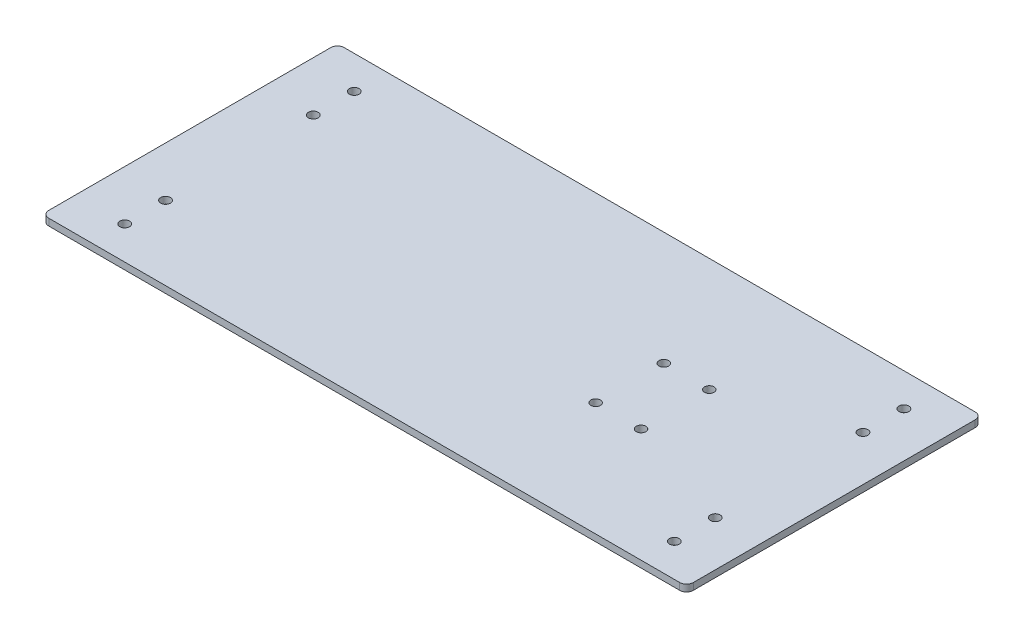
ISO-10303-21;
HEADER;
FILE_DESCRIPTION(('STEP AP214'),'2;1');
FILE_NAME('part.step','',(''),(''),'','','');
FILE_SCHEMA(('AUTOMOTIVE_DESIGN { 1 0 10303 214 1 1 1 1 }'));
ENDSEC;
DATA;
#1=APPLICATION_CONTEXT('core data for automotive mechanical design processes');
#2=APPLICATION_PROTOCOL_DEFINITION('international standard','automotive_design',2000,#1);
#3=PRODUCT_CONTEXT('',#1,'mechanical');
#4=PRODUCT('Part','Part','',(#3));
#5=PRODUCT_RELATED_PRODUCT_CATEGORY('part','',(#4));
#6=PRODUCT_DEFINITION_FORMATION('','',#4);
#7=PRODUCT_DEFINITION_CONTEXT('part definition',#1,'design');
#8=PRODUCT_DEFINITION('design','',#6,#7);
#9=PRODUCT_DEFINITION_SHAPE('','',#8);
#10=(LENGTH_UNIT() NAMED_UNIT(*) SI_UNIT(.MILLI.,.METRE.));
#11=(NAMED_UNIT(*) PLANE_ANGLE_UNIT() SI_UNIT($,.RADIAN.));
#12=(NAMED_UNIT(*) SI_UNIT($,.STERADIAN.) SOLID_ANGLE_UNIT());
#13=UNCERTAINTY_MEASURE_WITH_UNIT(LENGTH_MEASURE(1.E-05),#10,'distance_accuracy_value','');
#14=(GEOMETRIC_REPRESENTATION_CONTEXT(3) GLOBAL_UNCERTAINTY_ASSIGNED_CONTEXT((#13)) GLOBAL_UNIT_ASSIGNED_CONTEXT((#10,
#11,#12)) REPRESENTATION_CONTEXT('',''));
#15=CARTESIAN_POINT('',(0.,0.,0.));
#16=DIRECTION('',(0.,0.,1.));
#17=DIRECTION('',(1.,0.,0.));
#18=AXIS2_PLACEMENT_3D('',#15,#16,#17);
#19=CARTESIAN_POINT('',(0.,3.,0.));
#20=DIRECTION('',(0.,-1.,0.));
#21=DIRECTION('',(0.,0.,-1.));
#22=AXIS2_PLACEMENT_3D('',#19,#20,#21);
#23=PLANE('',#22);
#24=CARTESIAN_POINT('',(71.7899999999999,3.,-15.));
#25=DIRECTION('',(0.,-1.,0.));
#26=DIRECTION('',(0.,0.,-1.));
#27=AXIS2_PLACEMENT_3D('',#24,#25,#26);
#28=CIRCLE('',#27,2.1);
#29=CARTESIAN_POINT('',(71.7899999999999,3.,-17.1));
#30=VERTEX_POINT('',#29);
#31=EDGE_CURVE('E175',#30,#30,#28,.T.);
#32=ORIENTED_EDGE('',*,*,#31,.T.);
#33=EDGE_LOOP('',(#32));
#34=FACE_BOUND('',#33,.T.);
#35=CARTESIAN_POINT('',(51.79,3.,-15.));
#36=DIRECTION('',(0.,-1.,0.));
#37=DIRECTION('',(0.,0.,-1.));
#38=AXIS2_PLACEMENT_3D('',#35,#36,#37);
#39=CIRCLE('',#38,2.1);
#40=CARTESIAN_POINT('',(51.79,3.,-17.1));
#41=VERTEX_POINT('',#40);
#42=EDGE_CURVE('E180',#41,#41,#39,.T.);
#43=ORIENTED_EDGE('',*,*,#42,.T.);
#44=EDGE_LOOP('',(#43));
#45=FACE_BOUND('',#44,.T.);
#46=CARTESIAN_POINT('',(51.7899999999999,3.,15.));
#47=DIRECTION('',(0.,-1.,0.));
#48=DIRECTION('',(0.,0.,-1.));
#49=AXIS2_PLACEMENT_3D('',#46,#47,#48);
#50=CIRCLE('',#49,2.1);
#51=CARTESIAN_POINT('',(51.7899999999999,3.,12.9));
#52=VERTEX_POINT('',#51);
#53=EDGE_CURVE('E479',#52,#52,#50,.T.);
#54=ORIENTED_EDGE('',*,*,#53,.T.);
#55=EDGE_LOOP('',(#54));
#56=FACE_BOUND('',#55,.T.);
#57=CARTESIAN_POINT('',(71.7899999999999,3.,15.));
#58=DIRECTION('',(0.,-1.,0.));
#59=DIRECTION('',(0.,0.,-1.));
#60=AXIS2_PLACEMENT_3D('',#57,#58,#59);
#61=CIRCLE('',#60,2.1);
#62=CARTESIAN_POINT('',(71.7899999999999,3.,12.9));
#63=VERTEX_POINT('',#62);
#64=EDGE_CURVE('E476',#63,#63,#61,.T.);
#65=ORIENTED_EDGE('',*,*,#64,.T.);
#66=EDGE_LOOP('',(#65));
#67=FACE_BOUND('',#66,.T.);
#68=DIRECTION('',(-1.,0.,0.));
#69=VECTOR('',#68,1.);
#70=CARTESIAN_POINT('',(-141.79,3.,65.));
#71=LINE('',#70,#69);
#72=CARTESIAN_POINT('',(138.79,3.,65.));
#73=VERTEX_POINT('',#72);
#74=CARTESIAN_POINT('',(-138.79,3.,65.));
#75=VERTEX_POINT('',#74);
#76=EDGE_CURVE('E183',#73,#75,#71,.T.);
#77=ORIENTED_EDGE('',*,*,#76,.F.);
#78=CARTESIAN_POINT('',(138.79,3.,62.));
#79=DIRECTION('',(0.,-1.,0.));
#80=DIRECTION('',(0.,0.,-1.));
#81=AXIS2_PLACEMENT_3D('',#78,#79,#80);
#82=CIRCLE('',#81,3.);
#83=CARTESIAN_POINT('',(141.79,3.,62.));
#84=VERTEX_POINT('',#83);
#85=EDGE_CURVE('E158',#73,#84,#82,.F.);
#86=ORIENTED_EDGE('',*,*,#85,.T.);
#87=DIRECTION('',(0.,0.,-1.));
#88=VECTOR('',#87,1.);
#89=CARTESIAN_POINT('',(141.79,3.,55.5));
#90=LINE('',#89,#88);
#91=CARTESIAN_POINT('',(141.79,3.,-62.));
#92=VERTEX_POINT('',#91);
#93=EDGE_CURVE('E127',#84,#92,#90,.T.);
#94=ORIENTED_EDGE('',*,*,#93,.T.);
#95=CARTESIAN_POINT('',(138.79,3.,-62.));
#96=DIRECTION('',(0.,-1.,0.));
#97=DIRECTION('',(0.,0.,-1.));
#98=AXIS2_PLACEMENT_3D('',#95,#96,#97);
#99=CIRCLE('',#98,3.);
#100=CARTESIAN_POINT('',(138.79,3.,-65.));
#101=VERTEX_POINT('',#100);
#102=EDGE_CURVE('E153',#92,#101,#99,.F.);
#103=ORIENTED_EDGE('',*,*,#102,.T.);
#104=DIRECTION('',(1.,0.,0.));
#105=VECTOR('',#104,1.);
#106=CARTESIAN_POINT('',(-141.79,3.,-65.));
#107=LINE('',#106,#105);
#108=CARTESIAN_POINT('',(-138.79,3.,-65.));
#109=VERTEX_POINT('',#108);
#110=EDGE_CURVE('E171',#109,#101,#107,.T.);
#111=ORIENTED_EDGE('',*,*,#110,.F.);
#112=CARTESIAN_POINT('',(-138.79,3.,-62.));
#113=DIRECTION('',(0.,-1.,0.));
#114=DIRECTION('',(0.,0.,-1.));
#115=AXIS2_PLACEMENT_3D('',#112,#113,#114);
#116=CIRCLE('',#115,3.);
#117=CARTESIAN_POINT('',(-141.79,3.,-62.));
#118=VERTEX_POINT('',#117);
#119=EDGE_CURVE('E63',#109,#118,#116,.F.);
#120=ORIENTED_EDGE('',*,*,#119,.T.);
#121=DIRECTION('',(0.,0.,1.));
#122=VECTOR('',#121,1.);
#123=CARTESIAN_POINT('',(-141.79,3.,55.5));
#124=LINE('',#123,#122);
#125=CARTESIAN_POINT('',(-141.79,3.,62.));
#126=VERTEX_POINT('',#125);
#127=EDGE_CURVE('E142',#118,#126,#124,.T.);
#128=ORIENTED_EDGE('',*,*,#127,.T.);
#129=CARTESIAN_POINT('',(-138.79,3.,62.));
#130=DIRECTION('',(0.,-1.,0.));
#131=DIRECTION('',(0.,0.,-1.));
#132=AXIS2_PLACEMENT_3D('',#129,#130,#131);
#133=CIRCLE('',#132,3.);
#134=EDGE_CURVE('E156',#126,#75,#133,.F.);
#135=ORIENTED_EDGE('',*,*,#134,.T.);
#136=EDGE_LOOP('',(#77,#86,#94,#103,#111,#120,#128,#135));
#137=FACE_BOUND('',#136,.T.);
#138=CARTESIAN_POINT('',(121.925,3.,-50.5));
#139=DIRECTION('',(0.,1.,0.));
#140=DIRECTION('',(0.,0.,1.));
#141=AXIS2_PLACEMENT_3D('',#138,#139,#140);
#142=CIRCLE('',#141,2.15);
#143=CARTESIAN_POINT('',(121.925,3.,-48.35));
#144=VERTEX_POINT('',#143);
#145=EDGE_CURVE('E135',#144,#144,#142,.T.);
#146=ORIENTED_EDGE('',*,*,#145,.F.);
#147=EDGE_LOOP('',(#146));
#148=FACE_BOUND('',#147,.T.);
#149=CARTESIAN_POINT('',(121.925,3.,-32.5));
#150=DIRECTION('',(0.,1.,0.));
#151=DIRECTION('',(0.,0.,1.));
#152=AXIS2_PLACEMENT_3D('',#149,#150,#151);
#153=CIRCLE('',#152,2.15);
#154=CARTESIAN_POINT('',(121.925,3.,-30.35));
#155=VERTEX_POINT('',#154);
#156=EDGE_CURVE('E224',#155,#155,#153,.T.);
#157=ORIENTED_EDGE('',*,*,#156,.F.);
#158=EDGE_LOOP('',(#157));
#159=FACE_BOUND('',#158,.T.);
#160=CARTESIAN_POINT('',(121.925,3.,32.5));
#161=DIRECTION('',(0.,1.,0.));
#162=DIRECTION('',(0.,0.,1.));
#163=AXIS2_PLACEMENT_3D('',#160,#161,#162);
#164=CIRCLE('',#163,2.15);
#165=CARTESIAN_POINT('',(121.925,3.,34.65));
#166=VERTEX_POINT('',#165);
#167=EDGE_CURVE('E218',#166,#166,#164,.T.);
#168=ORIENTED_EDGE('',*,*,#167,.F.);
#169=EDGE_LOOP('',(#168));
#170=FACE_BOUND('',#169,.T.);
#171=CARTESIAN_POINT('',(121.925,3.,50.5));
#172=DIRECTION('',(0.,1.,0.));
#173=DIRECTION('',(0.,0.,1.));
#174=AXIS2_PLACEMENT_3D('',#171,#172,#173);
#175=CIRCLE('',#174,2.15);
#176=CARTESIAN_POINT('',(121.925,3.,52.65));
#177=VERTEX_POINT('',#176);
#178=EDGE_CURVE('E212',#177,#177,#175,.T.);
#179=ORIENTED_EDGE('',*,*,#178,.F.);
#180=EDGE_LOOP('',(#179));
#181=FACE_BOUND('',#180,.T.);
#182=CARTESIAN_POINT('',(-119.925,3.,-50.52));
#183=DIRECTION('',(0.,1.,0.));
#184=DIRECTION('',(0.,0.,1.));
#185=AXIS2_PLACEMENT_3D('',#182,#183,#184);
#186=CIRCLE('',#185,2.15);
#187=CARTESIAN_POINT('',(-119.925,3.,-48.37));
#188=VERTEX_POINT('',#187);
#189=EDGE_CURVE('E206',#188,#188,#186,.T.);
#190=ORIENTED_EDGE('',*,*,#189,.F.);
#191=EDGE_LOOP('',(#190));
#192=FACE_BOUND('',#191,.T.);
#193=CARTESIAN_POINT('',(-119.925,3.,-32.5));
#194=DIRECTION('',(0.,1.,0.));
#195=DIRECTION('',(0.,0.,1.));
#196=AXIS2_PLACEMENT_3D('',#193,#194,#195);
#197=CIRCLE('',#196,2.15);
#198=CARTESIAN_POINT('',(-119.925,3.,-30.35));
#199=VERTEX_POINT('',#198);
#200=EDGE_CURVE('E200',#199,#199,#197,.T.);
#201=ORIENTED_EDGE('',*,*,#200,.F.);
#202=EDGE_LOOP('',(#201));
#203=FACE_BOUND('',#202,.T.);
#204=CARTESIAN_POINT('',(-119.925,3.,32.5));
#205=DIRECTION('',(0.,1.,0.));
#206=DIRECTION('',(0.,0.,1.));
#207=AXIS2_PLACEMENT_3D('',#204,#205,#206);
#208=CIRCLE('',#207,2.15);
#209=CARTESIAN_POINT('',(-119.925,3.,34.65));
#210=VERTEX_POINT('',#209);
#211=EDGE_CURVE('E194',#210,#210,#208,.T.);
#212=ORIENTED_EDGE('',*,*,#211,.F.);
#213=EDGE_LOOP('',(#212));
#214=FACE_BOUND('',#213,.T.);
#215=CARTESIAN_POINT('',(-119.925,3.,50.48));
#216=DIRECTION('',(0.,1.,0.));
#217=DIRECTION('',(0.,0.,1.));
#218=AXIS2_PLACEMENT_3D('',#215,#216,#217);
#219=CIRCLE('',#218,2.15);
#220=CARTESIAN_POINT('',(-119.925,3.,52.63));
#221=VERTEX_POINT('',#220);
#222=EDGE_CURVE('E188',#221,#221,#219,.T.);
#223=ORIENTED_EDGE('',*,*,#222,.F.);
#224=EDGE_LOOP('',(#223));
#225=FACE_BOUND('',#224,.T.);
#226=ADVANCED_FACE('F41',(#34,#45,#56,#67,#137,#148,#159,#170,#181,#192,#203,#214,#225),#23,.F.);
#227=CARTESIAN_POINT('',(0.,0.,0.));
#228=DIRECTION('',(0.,-1.,0.));
#229=DIRECTION('',(0.,0.,-1.));
#230=AXIS2_PLACEMENT_3D('',#227,#228,#229);
#231=PLANE('',#230);
#232=CARTESIAN_POINT('',(71.7899999999999,0.,-15.));
#233=DIRECTION('',(0.,-1.,0.));
#234=DIRECTION('',(0.,0.,-1.));
#235=AXIS2_PLACEMENT_3D('',#232,#233,#234);
#236=CIRCLE('',#235,2.1);
#237=CARTESIAN_POINT('',(71.7899999999999,0.,-17.1));
#238=VERTEX_POINT('',#237);
#239=EDGE_CURVE('E464',#238,#238,#236,.T.);
#240=ORIENTED_EDGE('',*,*,#239,.F.);
#241=EDGE_LOOP('',(#240));
#242=FACE_BOUND('',#241,.T.);
#243=CARTESIAN_POINT('',(51.79,0.,-15.));
#244=DIRECTION('',(0.,-1.,0.));
#245=DIRECTION('',(0.,0.,-1.));
#246=AXIS2_PLACEMENT_3D('',#243,#244,#245);
#247=CIRCLE('',#246,2.1);
#248=CARTESIAN_POINT('',(51.79,0.,-17.1));
#249=VERTEX_POINT('',#248);
#250=EDGE_CURVE('E466',#249,#249,#247,.T.);
#251=ORIENTED_EDGE('',*,*,#250,.F.);
#252=EDGE_LOOP('',(#251));
#253=FACE_BOUND('',#252,.T.);
#254=CARTESIAN_POINT('',(51.7899999999999,0.,15.));
#255=DIRECTION('',(0.,-1.,0.));
#256=DIRECTION('',(0.,0.,-1.));
#257=AXIS2_PLACEMENT_3D('',#254,#255,#256);
#258=CIRCLE('',#257,2.1);
#259=CARTESIAN_POINT('',(51.7899999999999,0.,12.9));
#260=VERTEX_POINT('',#259);
#261=EDGE_CURVE('E469',#260,#260,#258,.T.);
#262=ORIENTED_EDGE('',*,*,#261,.F.);
#263=EDGE_LOOP('',(#262));
#264=FACE_BOUND('',#263,.T.);
#265=CARTESIAN_POINT('',(71.7899999999999,0.,15.));
#266=DIRECTION('',(0.,-1.,0.));
#267=DIRECTION('',(0.,0.,-1.));
#268=AXIS2_PLACEMENT_3D('',#265,#266,#267);
#269=CIRCLE('',#268,2.1);
#270=CARTESIAN_POINT('',(71.7899999999999,0.,12.9));
#271=VERTEX_POINT('',#270);
#272=EDGE_CURVE('E473',#271,#271,#269,.T.);
#273=ORIENTED_EDGE('',*,*,#272,.F.);
#274=EDGE_LOOP('',(#273));
#275=FACE_BOUND('',#274,.T.);
#276=CARTESIAN_POINT('',(-119.925,0.,32.5));
#277=DIRECTION('',(0.,1.,0.));
#278=DIRECTION('',(0.,0.,1.));
#279=AXIS2_PLACEMENT_3D('',#276,#277,#278);
#280=CIRCLE('',#279,2.15);
#281=CARTESIAN_POINT('',(-119.925,0.,34.65));
#282=VERTEX_POINT('',#281);
#283=EDGE_CURVE('E191',#282,#282,#280,.T.);
#284=ORIENTED_EDGE('',*,*,#283,.T.);
#285=EDGE_LOOP('',(#284));
#286=FACE_BOUND('',#285,.T.);
#287=CARTESIAN_POINT('',(-119.925,0.,-50.52));
#288=DIRECTION('',(0.,1.,0.));
#289=DIRECTION('',(0.,0.,1.));
#290=AXIS2_PLACEMENT_3D('',#287,#288,#289);
#291=CIRCLE('',#290,2.15);
#292=CARTESIAN_POINT('',(-119.925,0.,-48.37));
#293=VERTEX_POINT('',#292);
#294=EDGE_CURVE('E203',#293,#293,#291,.T.);
#295=ORIENTED_EDGE('',*,*,#294,.T.);
#296=EDGE_LOOP('',(#295));
#297=FACE_BOUND('',#296,.T.);
#298=CARTESIAN_POINT('',(121.925,0.,32.5));
#299=DIRECTION('',(0.,1.,0.));
#300=DIRECTION('',(0.,0.,1.));
#301=AXIS2_PLACEMENT_3D('',#298,#299,#300);
#302=CIRCLE('',#301,2.15);
#303=CARTESIAN_POINT('',(121.925,0.,34.65));
#304=VERTEX_POINT('',#303);
#305=EDGE_CURVE('E215',#304,#304,#302,.T.);
#306=ORIENTED_EDGE('',*,*,#305,.T.);
#307=EDGE_LOOP('',(#306));
#308=FACE_BOUND('',#307,.T.);
#309=CARTESIAN_POINT('',(121.925,0.,-50.5));
#310=DIRECTION('',(0.,1.,0.));
#311=DIRECTION('',(0.,0.,1.));
#312=AXIS2_PLACEMENT_3D('',#309,#310,#311);
#313=CIRCLE('',#312,2.15);
#314=CARTESIAN_POINT('',(121.925,0.,-48.35));
#315=VERTEX_POINT('',#314);
#316=EDGE_CURVE('E139',#315,#315,#313,.T.);
#317=ORIENTED_EDGE('',*,*,#316,.T.);
#318=EDGE_LOOP('',(#317));
#319=FACE_BOUND('',#318,.T.);
#320=DIRECTION('',(0.,0.,-1.));
#321=VECTOR('',#320,1.);
#322=CARTESIAN_POINT('',(141.79,0.,55.5));
#323=LINE('',#322,#321);
#324=CARTESIAN_POINT('',(141.79,0.,62.));
#325=VERTEX_POINT('',#324);
#326=CARTESIAN_POINT('',(141.79,0.,-62.));
#327=VERTEX_POINT('',#326);
#328=EDGE_CURVE('E124',#325,#327,#323,.T.);
#329=ORIENTED_EDGE('',*,*,#328,.F.);
#330=CARTESIAN_POINT('',(138.79,0.,62.));
#331=DIRECTION('',(0.,-1.,0.));
#332=DIRECTION('',(0.,0.,-1.));
#333=AXIS2_PLACEMENT_3D('',#330,#331,#332);
#334=CIRCLE('',#333,3.);
#335=CARTESIAN_POINT('',(138.79,0.,65.));
#336=VERTEX_POINT('',#335);
#337=EDGE_CURVE('E107',#325,#336,#334,.T.);
#338=ORIENTED_EDGE('',*,*,#337,.T.);
#339=DIRECTION('',(-1.,0.,0.));
#340=VECTOR('',#339,1.);
#341=CARTESIAN_POINT('',(-141.79,0.,65.));
#342=LINE('',#341,#340);
#343=CARTESIAN_POINT('',(-138.79,0.,65.));
#344=VERTEX_POINT('',#343);
#345=EDGE_CURVE('E177',#336,#344,#342,.T.);
#346=ORIENTED_EDGE('',*,*,#345,.T.);
#347=CARTESIAN_POINT('',(-138.79,0.,62.));
#348=DIRECTION('',(0.,-1.,0.));
#349=DIRECTION('',(0.,0.,-1.));
#350=AXIS2_PLACEMENT_3D('',#347,#348,#349);
#351=CIRCLE('',#350,3.);
#352=CARTESIAN_POINT('',(-141.79,0.,62.));
#353=VERTEX_POINT('',#352);
#354=EDGE_CURVE('E118',#344,#353,#351,.T.);
#355=ORIENTED_EDGE('',*,*,#354,.T.);
#356=DIRECTION('',(0.,0.,1.));
#357=VECTOR('',#356,1.);
#358=CARTESIAN_POINT('',(-141.79,0.,55.5));
#359=LINE('',#358,#357);
#360=CARTESIAN_POINT('',(-141.79,0.,-62.));
#361=VERTEX_POINT('',#360);
#362=EDGE_CURVE('E134',#361,#353,#359,.T.);
#363=ORIENTED_EDGE('',*,*,#362,.F.);
#364=CARTESIAN_POINT('',(-138.79,0.,-62.));
#365=DIRECTION('',(0.,-1.,0.));
#366=DIRECTION('',(0.,0.,-1.));
#367=AXIS2_PLACEMENT_3D('',#364,#365,#366);
#368=CIRCLE('',#367,3.);
#369=CARTESIAN_POINT('',(-138.79,0.,-65.));
#370=VERTEX_POINT('',#369);
#371=EDGE_CURVE('E147',#361,#370,#368,.T.);
#372=ORIENTED_EDGE('',*,*,#371,.T.);
#373=DIRECTION('',(1.,0.,0.));
#374=VECTOR('',#373,1.);
#375=CARTESIAN_POINT('',(-141.79,0.,-65.));
#376=LINE('',#375,#374);
#377=CARTESIAN_POINT('',(138.79,0.,-65.));
#378=VERTEX_POINT('',#377);
#379=EDGE_CURVE('E169',#370,#378,#376,.T.);
#380=ORIENTED_EDGE('',*,*,#379,.T.);
#381=CARTESIAN_POINT('',(138.79,0.,-62.));
#382=DIRECTION('',(0.,-1.,0.));
#383=DIRECTION('',(0.,0.,-1.));
#384=AXIS2_PLACEMENT_3D('',#381,#382,#383);
#385=CIRCLE('',#384,3.);
#386=EDGE_CURVE('E128',#378,#327,#385,.T.);
#387=ORIENTED_EDGE('',*,*,#386,.T.);
#388=EDGE_LOOP('',(#329,#338,#346,#355,#363,#372,#380,#387));
#389=FACE_BOUND('',#388,.T.);
#390=CARTESIAN_POINT('',(121.925,0.,-32.5));
#391=DIRECTION('',(0.,1.,0.));
#392=DIRECTION('',(0.,0.,1.));
#393=AXIS2_PLACEMENT_3D('',#390,#391,#392);
#394=CIRCLE('',#393,2.15);
#395=CARTESIAN_POINT('',(121.925,0.,-30.35));
#396=VERTEX_POINT('',#395);
#397=EDGE_CURVE('E221',#396,#396,#394,.T.);
#398=ORIENTED_EDGE('',*,*,#397,.T.);
#399=EDGE_LOOP('',(#398));
#400=FACE_BOUND('',#399,.T.);
#401=CARTESIAN_POINT('',(121.925,0.,50.5));
#402=DIRECTION('',(0.,1.,0.));
#403=DIRECTION('',(0.,0.,1.));
#404=AXIS2_PLACEMENT_3D('',#401,#402,#403);
#405=CIRCLE('',#404,2.15);
#406=CARTESIAN_POINT('',(121.925,0.,52.65));
#407=VERTEX_POINT('',#406);
#408=EDGE_CURVE('E209',#407,#407,#405,.T.);
#409=ORIENTED_EDGE('',*,*,#408,.T.);
#410=EDGE_LOOP('',(#409));
#411=FACE_BOUND('',#410,.T.);
#412=CARTESIAN_POINT('',(-119.925,0.,-32.5));
#413=DIRECTION('',(0.,1.,0.));
#414=DIRECTION('',(0.,0.,1.));
#415=AXIS2_PLACEMENT_3D('',#412,#413,#414);
#416=CIRCLE('',#415,2.15);
#417=CARTESIAN_POINT('',(-119.925,0.,-30.35));
#418=VERTEX_POINT('',#417);
#419=EDGE_CURVE('E197',#418,#418,#416,.T.);
#420=ORIENTED_EDGE('',*,*,#419,.T.);
#421=EDGE_LOOP('',(#420));
#422=FACE_BOUND('',#421,.T.);
#423=CARTESIAN_POINT('',(-119.925,0.,50.48));
#424=DIRECTION('',(0.,1.,0.));
#425=DIRECTION('',(0.,0.,1.));
#426=AXIS2_PLACEMENT_3D('',#423,#424,#425);
#427=CIRCLE('',#426,2.15);
#428=CARTESIAN_POINT('',(-119.925,0.,52.63));
#429=VERTEX_POINT('',#428);
#430=EDGE_CURVE('E186',#429,#429,#427,.T.);
#431=ORIENTED_EDGE('',*,*,#430,.T.);
#432=EDGE_LOOP('',(#431));
#433=FACE_BOUND('',#432,.T.);
#434=ADVANCED_FACE('F131',(#242,#253,#264,#275,#286,#297,#308,#319,#389,#400,#411,#422,#433),
#231,.T.);
#435=CARTESIAN_POINT('',(141.79,3.,55.5));
#436=DIRECTION('',(-1.,0.,0.));
#437=DIRECTION('',(0.,0.,1.));
#438=AXIS2_PLACEMENT_3D('',#435,#436,#437);
#439=PLANE('',#438);
#440=ORIENTED_EDGE('',*,*,#93,.F.);
#441=DIRECTION('',(0.,-1.,0.));
#442=VECTOR('',#441,1.);
#443=CARTESIAN_POINT('',(141.79,0.,62.));
#444=LINE('',#443,#442);
#445=EDGE_CURVE('E111',#84,#325,#444,.T.);
#446=ORIENTED_EDGE('',*,*,#445,.T.);
#447=ORIENTED_EDGE('',*,*,#328,.T.);
#448=DIRECTION('',(0.,-1.,0.));
#449=VECTOR('',#448,1.);
#450=CARTESIAN_POINT('',(141.79,3.,-62.));
#451=LINE('',#450,#449);
#452=EDGE_CURVE('E129',#327,#92,#451,.F.);
#453=ORIENTED_EDGE('',*,*,#452,.T.);
#454=EDGE_LOOP('',(#440,#446,#447,#453));
#455=FACE_BOUND('',#454,.T.);
#456=ADVANCED_FACE('F123',(#455),#439,.F.);
#457=CARTESIAN_POINT('',(-141.79,3.,55.5));
#458=DIRECTION('',(1.,0.,0.));
#459=DIRECTION('',(0.,0.,-1.));
#460=AXIS2_PLACEMENT_3D('',#457,#458,#459);
#461=PLANE('',#460);
#462=ORIENTED_EDGE('',*,*,#362,.T.);
#463=DIRECTION('',(0.,-1.,0.));
#464=VECTOR('',#463,1.);
#465=CARTESIAN_POINT('',(-141.79,3.,62.));
#466=LINE('',#465,#464);
#467=EDGE_CURVE('E56',#353,#126,#466,.F.);
#468=ORIENTED_EDGE('',*,*,#467,.T.);
#469=ORIENTED_EDGE('',*,*,#127,.F.);
#470=DIRECTION('',(0.,-1.,0.));
#471=VECTOR('',#470,1.);
#472=CARTESIAN_POINT('',(-141.79,0.,-62.));
#473=LINE('',#472,#471);
#474=EDGE_CURVE('E160',#118,#361,#473,.T.);
#475=ORIENTED_EDGE('',*,*,#474,.T.);
#476=EDGE_LOOP('',(#462,#468,#469,#475));
#477=FACE_BOUND('',#476,.T.);
#478=ADVANCED_FACE('F239',(#477),#461,.F.);
#479=CARTESIAN_POINT('',(121.925,3.,-50.5));
#480=DIRECTION('',(0.,-1.,0.));
#481=DIRECTION('',(0.,0.,-1.));
#482=AXIS2_PLACEMENT_3D('',#479,#480,#481);
#483=CYLINDRICAL_SURFACE('',#482,2.15);
#484=ORIENTED_EDGE('',*,*,#145,.T.);
#485=EDGE_LOOP('',(#484));
#486=FACE_BOUND('',#485,.T.);
#487=ORIENTED_EDGE('',*,*,#316,.F.);
#488=EDGE_LOOP('',(#487));
#489=FACE_BOUND('',#488,.T.);
#490=ADVANCED_FACE('F261',(#486,#489),#483,.F.);
#491=CARTESIAN_POINT('',(121.925,3.,-32.5));
#492=DIRECTION('',(0.,-1.,0.));
#493=DIRECTION('',(0.,0.,-1.));
#494=AXIS2_PLACEMENT_3D('',#491,#492,#493);
#495=CYLINDRICAL_SURFACE('',#494,2.15);
#496=ORIENTED_EDGE('',*,*,#156,.T.);
#497=EDGE_LOOP('',(#496));
#498=FACE_BOUND('',#497,.T.);
#499=ORIENTED_EDGE('',*,*,#397,.F.);
#500=EDGE_LOOP('',(#499));
#501=FACE_BOUND('',#500,.T.);
#502=ADVANCED_FACE('F339',(#498,#501),#495,.F.);
#503=CARTESIAN_POINT('',(121.925,3.,32.5));
#504=DIRECTION('',(0.,-1.,0.));
#505=DIRECTION('',(0.,0.,-1.));
#506=AXIS2_PLACEMENT_3D('',#503,#504,#505);
#507=CYLINDRICAL_SURFACE('',#506,2.15);
#508=ORIENTED_EDGE('',*,*,#167,.T.);
#509=EDGE_LOOP('',(#508));
#510=FACE_BOUND('',#509,.T.);
#511=ORIENTED_EDGE('',*,*,#305,.F.);
#512=EDGE_LOOP('',(#511));
#513=FACE_BOUND('',#512,.T.);
#514=ADVANCED_FACE('F336',(#510,#513),#507,.F.);
#515=CARTESIAN_POINT('',(121.925,3.,50.5));
#516=DIRECTION('',(0.,-1.,0.));
#517=DIRECTION('',(0.,0.,-1.));
#518=AXIS2_PLACEMENT_3D('',#515,#516,#517);
#519=CYLINDRICAL_SURFACE('',#518,2.15);
#520=ORIENTED_EDGE('',*,*,#178,.T.);
#521=EDGE_LOOP('',(#520));
#522=FACE_BOUND('',#521,.T.);
#523=ORIENTED_EDGE('',*,*,#408,.F.);
#524=EDGE_LOOP('',(#523));
#525=FACE_BOUND('',#524,.T.);
#526=ADVANCED_FACE('F332',(#522,#525),#519,.F.);
#527=CARTESIAN_POINT('',(-119.925,3.,-50.52));
#528=DIRECTION('',(0.,-1.,0.));
#529=DIRECTION('',(0.,0.,-1.));
#530=AXIS2_PLACEMENT_3D('',#527,#528,#529);
#531=CYLINDRICAL_SURFACE('',#530,2.15);
#532=ORIENTED_EDGE('',*,*,#189,.T.);
#533=EDGE_LOOP('',(#532));
#534=FACE_BOUND('',#533,.T.);
#535=ORIENTED_EDGE('',*,*,#294,.F.);
#536=EDGE_LOOP('',(#535));
#537=FACE_BOUND('',#536,.T.);
#538=ADVANCED_FACE('F328',(#534,#537),#531,.F.);
#539=CARTESIAN_POINT('',(-119.925,3.,-32.5));
#540=DIRECTION('',(0.,-1.,0.));
#541=DIRECTION('',(0.,0.,-1.));
#542=AXIS2_PLACEMENT_3D('',#539,#540,#541);
#543=CYLINDRICAL_SURFACE('',#542,2.15);
#544=ORIENTED_EDGE('',*,*,#200,.T.);
#545=EDGE_LOOP('',(#544));
#546=FACE_BOUND('',#545,.T.);
#547=ORIENTED_EDGE('',*,*,#419,.F.);
#548=EDGE_LOOP('',(#547));
#549=FACE_BOUND('',#548,.T.);
#550=ADVANCED_FACE('F324',(#546,#549),#543,.F.);
#551=CARTESIAN_POINT('',(-119.925,3.,32.5));
#552=DIRECTION('',(0.,-1.,0.));
#553=DIRECTION('',(0.,0.,-1.));
#554=AXIS2_PLACEMENT_3D('',#551,#552,#553);
#555=CYLINDRICAL_SURFACE('',#554,2.15);
#556=ORIENTED_EDGE('',*,*,#211,.T.);
#557=EDGE_LOOP('',(#556));
#558=FACE_BOUND('',#557,.T.);
#559=ORIENTED_EDGE('',*,*,#283,.F.);
#560=EDGE_LOOP('',(#559));
#561=FACE_BOUND('',#560,.T.);
#562=ADVANCED_FACE('F320',(#558,#561),#555,.F.);
#563=CARTESIAN_POINT('',(-119.925,3.,50.48));
#564=DIRECTION('',(0.,-1.,0.));
#565=DIRECTION('',(0.,0.,-1.));
#566=AXIS2_PLACEMENT_3D('',#563,#564,#565);
#567=CYLINDRICAL_SURFACE('',#566,2.15);
#568=ORIENTED_EDGE('',*,*,#222,.T.);
#569=EDGE_LOOP('',(#568));
#570=FACE_BOUND('',#569,.T.);
#571=ORIENTED_EDGE('',*,*,#430,.F.);
#572=EDGE_LOOP('',(#571));
#573=FACE_BOUND('',#572,.T.);
#574=ADVANCED_FACE('F317',(#570,#573),#567,.F.);
#575=CARTESIAN_POINT('',(-141.79,3.,65.));
#576=DIRECTION('',(0.,0.,1.));
#577=DIRECTION('',(1.,0.,0.));
#578=AXIS2_PLACEMENT_3D('',#575,#576,#577);
#579=PLANE('',#578);
#580=ORIENTED_EDGE('',*,*,#345,.F.);
#581=DIRECTION('',(0.,-1.,0.));
#582=VECTOR('',#581,1.);
#583=CARTESIAN_POINT('',(138.79,3.,65.));
#584=LINE('',#583,#582);
#585=EDGE_CURVE('E112',#336,#73,#584,.F.);
#586=ORIENTED_EDGE('',*,*,#585,.T.);
#587=ORIENTED_EDGE('',*,*,#76,.T.);
#588=DIRECTION('',(0.,-1.,0.));
#589=VECTOR('',#588,1.);
#590=CARTESIAN_POINT('',(-138.79,0.,65.));
#591=LINE('',#590,#589);
#592=EDGE_CURVE('E117',#75,#344,#591,.T.);
#593=ORIENTED_EDGE('',*,*,#592,.T.);
#594=EDGE_LOOP('',(#580,#586,#587,#593));
#595=FACE_BOUND('',#594,.T.);
#596=ADVANCED_FACE('F238',(#595),#579,.T.);
#597=CARTESIAN_POINT('',(-141.79,3.,-65.));
#598=DIRECTION('',(0.,0.,-1.));
#599=DIRECTION('',(-1.,0.,0.));
#600=AXIS2_PLACEMENT_3D('',#597,#598,#599);
#601=PLANE('',#600);
#602=ORIENTED_EDGE('',*,*,#379,.F.);
#603=DIRECTION('',(0.,-1.,0.));
#604=VECTOR('',#603,1.);
#605=CARTESIAN_POINT('',(-138.79,3.,-65.));
#606=LINE('',#605,#604);
#607=EDGE_CURVE('E11',#370,#109,#606,.F.);
#608=ORIENTED_EDGE('',*,*,#607,.T.);
#609=ORIENTED_EDGE('',*,*,#110,.T.);
#610=DIRECTION('',(0.,-1.,0.));
#611=VECTOR('',#610,1.);
#612=CARTESIAN_POINT('',(138.79,0.,-65.));
#613=LINE('',#612,#611);
#614=EDGE_CURVE('E49',#101,#378,#613,.T.);
#615=ORIENTED_EDGE('',*,*,#614,.T.);
#616=EDGE_LOOP('',(#602,#608,#609,#615));
#617=FACE_BOUND('',#616,.T.);
#618=ADVANCED_FACE('F168',(#617),#601,.T.);
#619=CARTESIAN_POINT('',(138.79,3.,62.));
#620=DIRECTION('',(0.,1.,0.));
#621=DIRECTION('',(0.,0.,1.));
#622=AXIS2_PLACEMENT_3D('',#619,#620,#621);
#623=CYLINDRICAL_SURFACE('',#622,3.);
#624=ORIENTED_EDGE('',*,*,#85,.F.);
#625=ORIENTED_EDGE('',*,*,#585,.F.);
#626=ORIENTED_EDGE('',*,*,#337,.F.);
#627=ORIENTED_EDGE('',*,*,#445,.F.);
#628=EDGE_LOOP('',(#624,#625,#626,#627));
#629=FACE_BOUND('',#628,.T.);
#630=ADVANCED_FACE('F110',(#629),#623,.T.);
#631=CARTESIAN_POINT('',(-138.79,3.,62.));
#632=DIRECTION('',(0.,1.,0.));
#633=DIRECTION('',(0.,0.,1.));
#634=AXIS2_PLACEMENT_3D('',#631,#632,#633);
#635=CYLINDRICAL_SURFACE('',#634,3.);
#636=ORIENTED_EDGE('',*,*,#134,.F.);
#637=ORIENTED_EDGE('',*,*,#467,.F.);
#638=ORIENTED_EDGE('',*,*,#354,.F.);
#639=ORIENTED_EDGE('',*,*,#592,.F.);
#640=EDGE_LOOP('',(#636,#637,#638,#639));
#641=FACE_BOUND('',#640,.T.);
#642=ADVANCED_FACE('F236',(#641),#635,.T.);
#643=CARTESIAN_POINT('',(-138.79,3.,-62.));
#644=DIRECTION('',(0.,1.,0.));
#645=DIRECTION('',(0.,0.,1.));
#646=AXIS2_PLACEMENT_3D('',#643,#644,#645);
#647=CYLINDRICAL_SURFACE('',#646,3.);
#648=ORIENTED_EDGE('',*,*,#119,.F.);
#649=ORIENTED_EDGE('',*,*,#607,.F.);
#650=ORIENTED_EDGE('',*,*,#371,.F.);
#651=ORIENTED_EDGE('',*,*,#474,.F.);
#652=EDGE_LOOP('',(#648,#649,#650,#651));
#653=FACE_BOUND('',#652,.T.);
#654=ADVANCED_FACE('F241',(#653),#647,.T.);
#655=CARTESIAN_POINT('',(138.79,3.,-62.));
#656=DIRECTION('',(0.,1.,0.));
#657=DIRECTION('',(0.,0.,1.));
#658=AXIS2_PLACEMENT_3D('',#655,#656,#657);
#659=CYLINDRICAL_SURFACE('',#658,3.);
#660=ORIENTED_EDGE('',*,*,#102,.F.);
#661=ORIENTED_EDGE('',*,*,#452,.F.);
#662=ORIENTED_EDGE('',*,*,#386,.F.);
#663=ORIENTED_EDGE('',*,*,#614,.F.);
#664=EDGE_LOOP('',(#660,#661,#662,#663));
#665=FACE_BOUND('',#664,.T.);
#666=ADVANCED_FACE('F43',(#665),#659,.T.);
#667=CARTESIAN_POINT('',(71.7899999999999,10.,15.));
#668=DIRECTION('',(0.,-1.,0.));
#669=DIRECTION('',(0.,0.,-1.));
#670=AXIS2_PLACEMENT_3D('',#667,#668,#669);
#671=CYLINDRICAL_SURFACE('',#670,2.1);
#672=ORIENTED_EDGE('',*,*,#272,.T.);
#673=EDGE_LOOP('',(#672));
#674=FACE_BOUND('',#673,.T.);
#675=ORIENTED_EDGE('',*,*,#64,.F.);
#676=EDGE_LOOP('',(#675));
#677=FACE_BOUND('',#676,.T.);
#678=ADVANCED_FACE('F243',(#674,#677),#671,.F.);
#679=CARTESIAN_POINT('',(51.7899999999999,10.,15.));
#680=DIRECTION('',(0.,-1.,0.));
#681=DIRECTION('',(0.,0.,-1.));
#682=AXIS2_PLACEMENT_3D('',#679,#680,#681);
#683=CYLINDRICAL_SURFACE('',#682,2.1);
#684=ORIENTED_EDGE('',*,*,#261,.T.);
#685=EDGE_LOOP('',(#684));
#686=FACE_BOUND('',#685,.T.);
#687=ORIENTED_EDGE('',*,*,#53,.F.);
#688=EDGE_LOOP('',(#687));
#689=FACE_BOUND('',#688,.T.);
#690=ADVANCED_FACE('F249',(#686,#689),#683,.F.);
#691=CARTESIAN_POINT('',(51.79,10.,-15.));
#692=DIRECTION('',(0.,-1.,0.));
#693=DIRECTION('',(0.,0.,-1.));
#694=AXIS2_PLACEMENT_3D('',#691,#692,#693);
#695=CYLINDRICAL_SURFACE('',#694,2.1);
#696=ORIENTED_EDGE('',*,*,#250,.T.);
#697=EDGE_LOOP('',(#696));
#698=FACE_BOUND('',#697,.T.);
#699=ORIENTED_EDGE('',*,*,#42,.F.);
#700=EDGE_LOOP('',(#699));
#701=FACE_BOUND('',#700,.T.);
#702=ADVANCED_FACE('F293',(#698,#701),#695,.F.);
#703=CARTESIAN_POINT('',(71.7899999999999,10.,-15.));
#704=DIRECTION('',(0.,-1.,0.));
#705=DIRECTION('',(0.,0.,-1.));
#706=AXIS2_PLACEMENT_3D('',#703,#704,#705);
#707=CYLINDRICAL_SURFACE('',#706,2.1);
#708=ORIENTED_EDGE('',*,*,#239,.T.);
#709=EDGE_LOOP('',(#708));
#710=FACE_BOUND('',#709,.T.);
#711=ORIENTED_EDGE('',*,*,#31,.F.);
#712=EDGE_LOOP('',(#711));
#713=FACE_BOUND('',#712,.T.);
#714=ADVANCED_FACE('F301',(#710,#713),#707,.F.);
#715=CLOSED_SHELL('',(#226,#434,#456,#478,#490,#502,#514,#526,#538,#550,#562,#574,#596,#618,
#630,#642,#654,#666,#678,#690,#702,#714));
#716=MANIFOLD_SOLID_BREP('B2',#715);
#717=ADVANCED_BREP_SHAPE_REPRESENTATION('',(#18,#716),#14);
#718=SHAPE_DEFINITION_REPRESENTATION(#9,#717);
ENDSEC;
END-ISO-10303-21;
